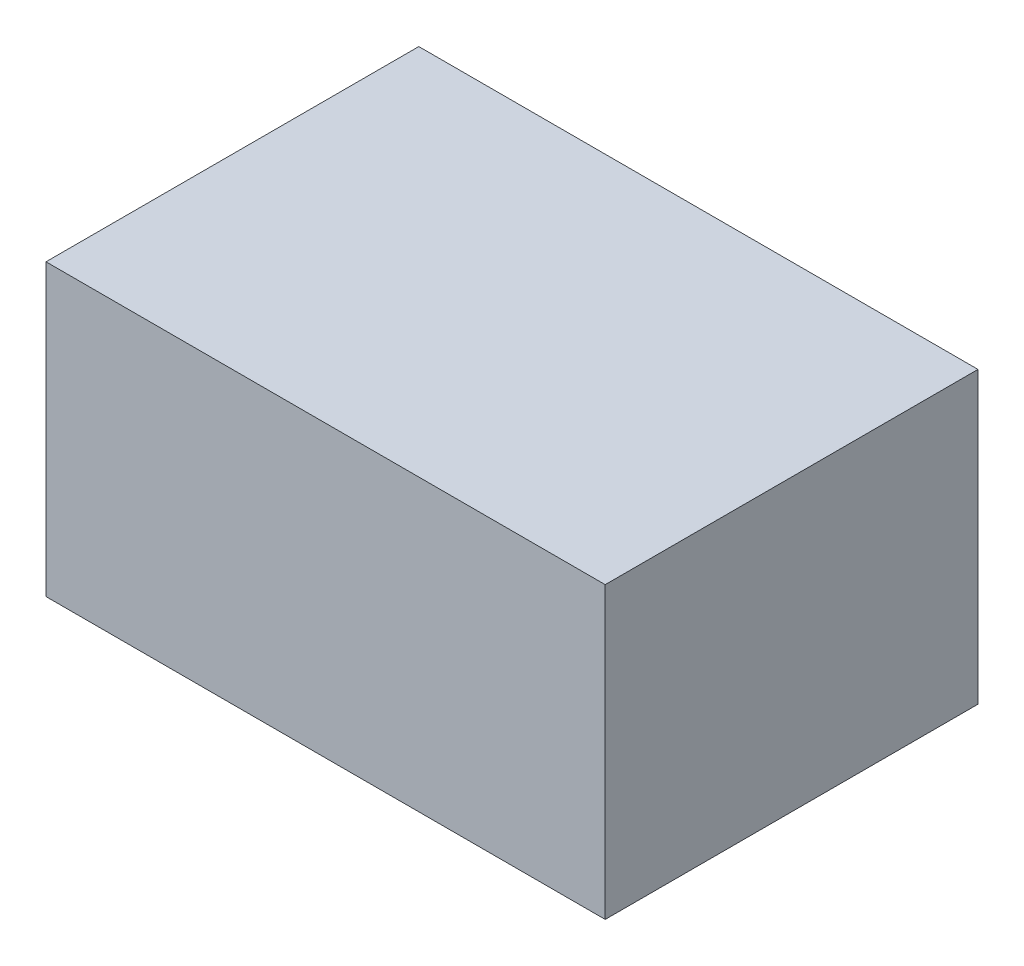
ISO-10303-21;
HEADER;
FILE_DESCRIPTION(('STEP AP214'),'2;1');
FILE_NAME('part.step','',(''),(''),'','','');
FILE_SCHEMA(('AUTOMOTIVE_DESIGN { 1 0 10303 214 1 1 1 1 }'));
ENDSEC;
DATA;
#1=APPLICATION_CONTEXT('core data for automotive mechanical design processes');
#2=APPLICATION_PROTOCOL_DEFINITION('international standard','automotive_design',2000,#1);
#3=PRODUCT_CONTEXT('',#1,'mechanical');
#4=PRODUCT('Part','Part','',(#3));
#5=PRODUCT_RELATED_PRODUCT_CATEGORY('part','',(#4));
#6=PRODUCT_DEFINITION_FORMATION('','',#4);
#7=PRODUCT_DEFINITION_CONTEXT('part definition',#1,'design');
#8=PRODUCT_DEFINITION('design','',#6,#7);
#9=PRODUCT_DEFINITION_SHAPE('','',#8);
#10=(LENGTH_UNIT() NAMED_UNIT(*) SI_UNIT(.MILLI.,.METRE.));
#11=(NAMED_UNIT(*) PLANE_ANGLE_UNIT() SI_UNIT($,.RADIAN.));
#12=(NAMED_UNIT(*) SI_UNIT($,.STERADIAN.) SOLID_ANGLE_UNIT());
#13=UNCERTAINTY_MEASURE_WITH_UNIT(LENGTH_MEASURE(1.E-05),#10,'distance_accuracy_value','');
#14=(GEOMETRIC_REPRESENTATION_CONTEXT(3) GLOBAL_UNCERTAINTY_ASSIGNED_CONTEXT((#13)) GLOBAL_UNIT_ASSIGNED_CONTEXT((#10,
#11,#12)) REPRESENTATION_CONTEXT('',''));
#15=CARTESIAN_POINT('',(0.,0.,0.));
#16=DIRECTION('',(0.,0.,1.));
#17=DIRECTION('',(1.,0.,0.));
#18=AXIS2_PLACEMENT_3D('',#15,#16,#17);
#19=CARTESIAN_POINT('',(18.0863944316362,-1.34999972918496,12.6326952338184));
#20=DIRECTION('',(-1.,0.,0.));
#21=DIRECTION('',(0.,0.,1.));
#22=AXIS2_PLACEMENT_3D('',#19,#20,#21);
#23=PLANE('',#22);
#24=DIRECTION('',(0.,-1.,0.));
#25=VECTOR('',#24,1.);
#26=CARTESIAN_POINT('',(18.0863944316362,-1.34999972918496,3.6326952338184));
#27=LINE('',#26,#25);
#28=CARTESIAN_POINT('',(18.0863944316362,-1.34999972918496,3.6326952338184));
#29=VERTEX_POINT('',#28);
#30=CARTESIAN_POINT('',(18.0863944316362,-8.34999972918496,3.6326952338184));
#31=VERTEX_POINT('',#30);
#32=EDGE_CURVE('E37',#29,#31,#27,.T.);
#33=ORIENTED_EDGE('',*,*,#32,.T.);
#34=DIRECTION('',(0.,0.,-1.));
#35=VECTOR('',#34,1.);
#36=CARTESIAN_POINT('',(18.0863944316362,-8.34999972918496,12.6326952338184));
#37=LINE('',#36,#35);
#38=CARTESIAN_POINT('',(18.0863944316362,-8.34999972918496,12.6326952338184));
#39=VERTEX_POINT('',#38);
#40=EDGE_CURVE('E74',#39,#31,#37,.T.);
#41=ORIENTED_EDGE('',*,*,#40,.F.);
#42=DIRECTION('',(0.,-1.,0.));
#43=VECTOR('',#42,1.);
#44=CARTESIAN_POINT('',(18.0863944316362,-1.34999972918496,12.6326952338184));
#45=LINE('',#44,#43);
#46=CARTESIAN_POINT('',(18.0863944316362,-1.34999972918496,12.6326952338184));
#47=VERTEX_POINT('',#46);
#48=EDGE_CURVE('E11',#47,#39,#45,.T.);
#49=ORIENTED_EDGE('',*,*,#48,.F.);
#50=DIRECTION('',(0.,0.,-1.));
#51=VECTOR('',#50,1.);
#52=CARTESIAN_POINT('',(18.0863944316362,-1.34999972918496,12.6326952338184));
#53=LINE('',#52,#51);
#54=EDGE_CURVE('E75',#47,#29,#53,.T.);
#55=ORIENTED_EDGE('',*,*,#54,.T.);
#56=EDGE_LOOP('',(#33,#41,#49,#55));
#57=FACE_BOUND('',#56,.T.);
#58=ADVANCED_FACE('F34',(#57),#23,.T.);
#59=CARTESIAN_POINT('',(31.5863944316362,-1.34999972918496,12.6326952338184));
#60=DIRECTION('',(0.,0.,1.));
#61=DIRECTION('',(1.,0.,0.));
#62=AXIS2_PLACEMENT_3D('',#59,#60,#61);
#63=PLANE('',#62);
#64=ORIENTED_EDGE('',*,*,#48,.T.);
#65=DIRECTION('',(-1.,0.,0.));
#66=VECTOR('',#65,1.);
#67=CARTESIAN_POINT('',(31.5863944316362,-8.34999972918496,12.6326952338184));
#68=LINE('',#67,#66);
#69=CARTESIAN_POINT('',(31.5863944316362,-8.34999972918496,12.6326952338184));
#70=VERTEX_POINT('',#69);
#71=EDGE_CURVE('E91',#70,#39,#68,.T.);
#72=ORIENTED_EDGE('',*,*,#71,.F.);
#73=DIRECTION('',(0.,-1.,0.));
#74=VECTOR('',#73,1.);
#75=CARTESIAN_POINT('',(31.5863944316362,-1.34999972918496,12.6326952338184));
#76=LINE('',#75,#74);
#77=CARTESIAN_POINT('',(31.5863944316362,-1.34999972918496,12.6326952338184));
#78=VERTEX_POINT('',#77);
#79=EDGE_CURVE('E42',#78,#70,#76,.T.);
#80=ORIENTED_EDGE('',*,*,#79,.F.);
#81=DIRECTION('',(-1.,0.,0.));
#82=VECTOR('',#81,1.);
#83=CARTESIAN_POINT('',(31.5863944316362,-1.34999972918496,12.6326952338184));
#84=LINE('',#83,#82);
#85=EDGE_CURVE('E80',#78,#47,#84,.T.);
#86=ORIENTED_EDGE('',*,*,#85,.T.);
#87=EDGE_LOOP('',(#64,#72,#80,#86));
#88=FACE_BOUND('',#87,.T.);
#89=ADVANCED_FACE('F106',(#88),#63,.T.);
#90=CARTESIAN_POINT('',(31.5863944316362,-1.34999972918496,3.6326952338184));
#91=DIRECTION('',(1.,0.,0.));
#92=DIRECTION('',(0.,0.,-1.));
#93=AXIS2_PLACEMENT_3D('',#90,#91,#92);
#94=PLANE('',#93);
#95=ORIENTED_EDGE('',*,*,#79,.T.);
#96=DIRECTION('',(0.,0.,1.));
#97=VECTOR('',#96,1.);
#98=CARTESIAN_POINT('',(31.5863944316362,-8.34999972918496,3.6326952338184));
#99=LINE('',#98,#97);
#100=CARTESIAN_POINT('',(31.5863944316362,-8.34999972918496,3.6326952338184));
#101=VERTEX_POINT('',#100);
#102=EDGE_CURVE('E87',#101,#70,#99,.T.);
#103=ORIENTED_EDGE('',*,*,#102,.F.);
#104=DIRECTION('',(0.,-1.,0.));
#105=VECTOR('',#104,1.);
#106=CARTESIAN_POINT('',(31.5863944316362,-1.34999972918496,3.6326952338184));
#107=LINE('',#106,#105);
#108=CARTESIAN_POINT('',(31.5863944316362,-1.34999972918496,3.6326952338184));
#109=VERTEX_POINT('',#108);
#110=EDGE_CURVE('E79',#109,#101,#107,.T.);
#111=ORIENTED_EDGE('',*,*,#110,.F.);
#112=DIRECTION('',(0.,0.,1.));
#113=VECTOR('',#112,1.);
#114=CARTESIAN_POINT('',(31.5863944316362,-1.34999972918496,3.6326952338184));
#115=LINE('',#114,#113);
#116=EDGE_CURVE('E99',#109,#78,#115,.T.);
#117=ORIENTED_EDGE('',*,*,#116,.T.);
#118=EDGE_LOOP('',(#95,#103,#111,#117));
#119=FACE_BOUND('',#118,.T.);
#120=ADVANCED_FACE('F103',(#119),#94,.T.);
#121=CARTESIAN_POINT('',(18.0863944316362,-1.34999972918496,3.6326952338184));
#122=DIRECTION('',(0.,0.,-1.));
#123=DIRECTION('',(-1.,0.,0.));
#124=AXIS2_PLACEMENT_3D('',#121,#122,#123);
#125=PLANE('',#124);
#126=ORIENTED_EDGE('',*,*,#110,.T.);
#127=DIRECTION('',(1.,0.,0.));
#128=VECTOR('',#127,1.);
#129=CARTESIAN_POINT('',(18.0863944316362,-8.34999972918496,3.6326952338184));
#130=LINE('',#129,#128);
#131=EDGE_CURVE('E82',#31,#101,#130,.T.);
#132=ORIENTED_EDGE('',*,*,#131,.F.);
#133=ORIENTED_EDGE('',*,*,#32,.F.);
#134=DIRECTION('',(1.,0.,0.));
#135=VECTOR('',#134,1.);
#136=CARTESIAN_POINT('',(18.0863944316362,-1.34999972918496,3.6326952338184));
#137=LINE('',#136,#135);
#138=EDGE_CURVE('E97',#29,#109,#137,.T.);
#139=ORIENTED_EDGE('',*,*,#138,.T.);
#140=EDGE_LOOP('',(#126,#132,#133,#139));
#141=FACE_BOUND('',#140,.T.);
#142=ADVANCED_FACE('F83',(#141),#125,.T.);
#143=CARTESIAN_POINT('',(0.,-1.34999972918496,0.));
#144=DIRECTION('',(0.,-1.,0.));
#145=DIRECTION('',(0.,0.,-1.));
#146=AXIS2_PLACEMENT_3D('',#143,#144,#145);
#147=PLANE('',#146);
#148=ORIENTED_EDGE('',*,*,#54,.F.);
#149=ORIENTED_EDGE('',*,*,#85,.F.);
#150=ORIENTED_EDGE('',*,*,#116,.F.);
#151=ORIENTED_EDGE('',*,*,#138,.F.);
#152=EDGE_LOOP('',(#148,#149,#150,#151));
#153=FACE_BOUND('',#152,.T.);
#154=ADVANCED_FACE('F108',(#153),#147,.F.);
#155=CARTESIAN_POINT('',(0.,-8.34999972918496,0.));
#156=DIRECTION('',(0.,-1.,0.));
#157=DIRECTION('',(0.,0.,-1.));
#158=AXIS2_PLACEMENT_3D('',#155,#156,#157);
#159=PLANE('',#158);
#160=ORIENTED_EDGE('',*,*,#40,.T.);
#161=ORIENTED_EDGE('',*,*,#131,.T.);
#162=ORIENTED_EDGE('',*,*,#102,.T.);
#163=ORIENTED_EDGE('',*,*,#71,.T.);
#164=EDGE_LOOP('',(#160,#161,#162,#163));
#165=FACE_BOUND('',#164,.T.);
#166=ADVANCED_FACE('F90',(#165),#159,.T.);
#167=CLOSED_SHELL('',(#58,#89,#120,#142,#154,#166));
#168=MANIFOLD_SOLID_BREP('B2',#167);
#169=ADVANCED_BREP_SHAPE_REPRESENTATION('',(#18,#168),#14);
#170=SHAPE_DEFINITION_REPRESENTATION(#9,#169);
ENDSEC;
END-ISO-10303-21;
